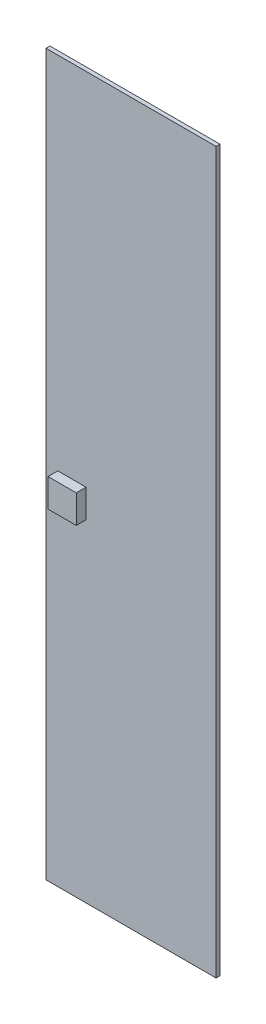
ISO-10303-21;
HEADER;
FILE_DESCRIPTION(('STEP AP214'),'2;1');
FILE_NAME('part.step','',(''),(''),'','','');
FILE_SCHEMA(('AUTOMOTIVE_DESIGN { 1 0 10303 214 1 1 1 1 }'));
ENDSEC;
DATA;
#1=APPLICATION_CONTEXT('core data for automotive mechanical design processes');
#2=APPLICATION_PROTOCOL_DEFINITION('international standard','automotive_design',2000,#1);
#3=PRODUCT_CONTEXT('',#1,'mechanical');
#4=PRODUCT('Part','Part','',(#3));
#5=PRODUCT_RELATED_PRODUCT_CATEGORY('part','',(#4));
#6=PRODUCT_DEFINITION_FORMATION('','',#4);
#7=PRODUCT_DEFINITION_CONTEXT('part definition',#1,'design');
#8=PRODUCT_DEFINITION('design','',#6,#7);
#9=PRODUCT_DEFINITION_SHAPE('','',#8);
#10=(LENGTH_UNIT() NAMED_UNIT(*) SI_UNIT(.MILLI.,.METRE.));
#11=(NAMED_UNIT(*) PLANE_ANGLE_UNIT() SI_UNIT($,.RADIAN.));
#12=(NAMED_UNIT(*) SI_UNIT($,.STERADIAN.) SOLID_ANGLE_UNIT());
#13=UNCERTAINTY_MEASURE_WITH_UNIT(LENGTH_MEASURE(1.E-05),#10,'distance_accuracy_value','');
#14=(GEOMETRIC_REPRESENTATION_CONTEXT(3) GLOBAL_UNCERTAINTY_ASSIGNED_CONTEXT((#13)) GLOBAL_UNIT_ASSIGNED_CONTEXT((#10,
#11,#12)) REPRESENTATION_CONTEXT('',''));
#15=CARTESIAN_POINT('',(0.,0.,0.));
#16=DIRECTION('',(0.,0.,1.));
#17=DIRECTION('',(1.,0.,0.));
#18=AXIS2_PLACEMENT_3D('',#15,#16,#17);
#19=CARTESIAN_POINT('',(216.75,-918.5,10.));
#20=DIRECTION('',(-1.,0.,0.));
#21=DIRECTION('',(0.,0.,1.));
#22=AXIS2_PLACEMENT_3D('',#19,#20,#21);
#23=PLANE('',#22);
#24=DIRECTION('',(0.,1.,0.));
#25=VECTOR('',#24,1.);
#26=CARTESIAN_POINT('',(216.75,-918.5,0.));
#27=LINE('',#26,#25);
#28=CARTESIAN_POINT('',(216.75,-918.5,0.));
#29=VERTEX_POINT('',#28);
#30=CARTESIAN_POINT('',(216.75,918.5,0.));
#31=VERTEX_POINT('',#30);
#32=EDGE_CURVE('E188',#29,#31,#27,.T.);
#33=ORIENTED_EDGE('',*,*,#32,.T.);
#34=DIRECTION('',(0.,0.,-1.));
#35=VECTOR('',#34,1.);
#36=CARTESIAN_POINT('',(216.75,918.5,10.));
#37=LINE('',#36,#35);
#38=CARTESIAN_POINT('',(216.75,918.5,10.));
#39=VERTEX_POINT('',#38);
#40=EDGE_CURVE('E215',#39,#31,#37,.T.);
#41=ORIENTED_EDGE('',*,*,#40,.F.);
#42=DIRECTION('',(0.,1.,0.));
#43=VECTOR('',#42,1.);
#44=CARTESIAN_POINT('',(216.75,-918.5,10.));
#45=LINE('',#44,#43);
#46=CARTESIAN_POINT('',(216.75,-918.5,10.));
#47=VERTEX_POINT('',#46);
#48=EDGE_CURVE('E189',#47,#39,#45,.T.);
#49=ORIENTED_EDGE('',*,*,#48,.F.);
#50=DIRECTION('',(0.,0.,-1.));
#51=VECTOR('',#50,1.);
#52=CARTESIAN_POINT('',(216.75,-918.5,10.));
#53=LINE('',#52,#51);
#54=EDGE_CURVE('E199',#47,#29,#53,.T.);
#55=ORIENTED_EDGE('',*,*,#54,.T.);
#56=EDGE_LOOP('',(#33,#41,#49,#55));
#57=FACE_BOUND('',#56,.T.);
#58=ADVANCED_FACE('F43',(#57),#23,.F.);
#59=CARTESIAN_POINT('',(-216.75,918.5,10.));
#60=DIRECTION('',(0.,-1.,0.));
#61=DIRECTION('',(0.,0.,-1.));
#62=AXIS2_PLACEMENT_3D('',#59,#60,#61);
#63=PLANE('',#62);
#64=DIRECTION('',(-1.,0.,0.));
#65=VECTOR('',#64,1.);
#66=CARTESIAN_POINT('',(-216.75,918.5,0.));
#67=LINE('',#66,#65);
#68=CARTESIAN_POINT('',(-216.75,918.5,0.));
#69=VERTEX_POINT('',#68);
#70=EDGE_CURVE('E202',#31,#69,#67,.T.);
#71=ORIENTED_EDGE('',*,*,#70,.T.);
#72=DIRECTION('',(0.,0.,-1.));
#73=VECTOR('',#72,1.);
#74=CARTESIAN_POINT('',(-216.75,918.5,10.));
#75=LINE('',#74,#73);
#76=CARTESIAN_POINT('',(-216.75,918.5,10.));
#77=VERTEX_POINT('',#76);
#78=EDGE_CURVE('E212',#77,#69,#75,.T.);
#79=ORIENTED_EDGE('',*,*,#78,.F.);
#80=DIRECTION('',(-1.,0.,0.));
#81=VECTOR('',#80,1.);
#82=CARTESIAN_POINT('',(-216.75,918.5,10.));
#83=LINE('',#82,#81);
#84=EDGE_CURVE('E192',#39,#77,#83,.T.);
#85=ORIENTED_EDGE('',*,*,#84,.F.);
#86=ORIENTED_EDGE('',*,*,#40,.T.);
#87=EDGE_LOOP('',(#71,#79,#85,#86));
#88=FACE_BOUND('',#87,.T.);
#89=ADVANCED_FACE('F251',(#88),#63,.F.);
#90=CARTESIAN_POINT('',(-216.75,-918.5,10.));
#91=DIRECTION('',(1.,0.,0.));
#92=DIRECTION('',(0.,0.,-1.));
#93=AXIS2_PLACEMENT_3D('',#90,#91,#92);
#94=PLANE('',#93);
#95=DIRECTION('',(0.,-1.,0.));
#96=VECTOR('',#95,1.);
#97=CARTESIAN_POINT('',(-216.75,-918.5,0.));
#98=LINE('',#97,#96);
#99=CARTESIAN_POINT('',(-216.75,-918.5,0.));
#100=VERTEX_POINT('',#99);
#101=EDGE_CURVE('E204',#69,#100,#98,.T.);
#102=ORIENTED_EDGE('',*,*,#101,.T.);
#103=DIRECTION('',(0.,0.,-1.));
#104=VECTOR('',#103,1.);
#105=CARTESIAN_POINT('',(-216.75,-918.5,10.));
#106=LINE('',#105,#104);
#107=CARTESIAN_POINT('',(-216.75,-918.5,10.));
#108=VERTEX_POINT('',#107);
#109=EDGE_CURVE('E209',#108,#100,#106,.T.);
#110=ORIENTED_EDGE('',*,*,#109,.F.);
#111=DIRECTION('',(0.,-1.,0.));
#112=VECTOR('',#111,1.);
#113=CARTESIAN_POINT('',(-216.75,-918.5,10.));
#114=LINE('',#113,#112);
#115=EDGE_CURVE('E195',#77,#108,#114,.T.);
#116=ORIENTED_EDGE('',*,*,#115,.F.);
#117=ORIENTED_EDGE('',*,*,#78,.T.);
#118=EDGE_LOOP('',(#102,#110,#116,#117));
#119=FACE_BOUND('',#118,.T.);
#120=ADVANCED_FACE('F256',(#119),#94,.F.);
#121=CARTESIAN_POINT('',(-216.75,-918.5,10.));
#122=DIRECTION('',(0.,1.,0.));
#123=DIRECTION('',(0.,0.,1.));
#124=AXIS2_PLACEMENT_3D('',#121,#122,#123);
#125=PLANE('',#124);
#126=DIRECTION('',(1.,0.,0.));
#127=VECTOR('',#126,1.);
#128=CARTESIAN_POINT('',(-216.75,-918.5,0.));
#129=LINE('',#128,#127);
#130=EDGE_CURVE('E193',#100,#29,#129,.T.);
#131=ORIENTED_EDGE('',*,*,#130,.T.);
#132=ORIENTED_EDGE('',*,*,#54,.F.);
#133=DIRECTION('',(1.,0.,0.));
#134=VECTOR('',#133,1.);
#135=CARTESIAN_POINT('',(-216.75,-918.5,10.));
#136=LINE('',#135,#134);
#137=EDGE_CURVE('E197',#108,#47,#136,.T.);
#138=ORIENTED_EDGE('',*,*,#137,.F.);
#139=ORIENTED_EDGE('',*,*,#109,.T.);
#140=EDGE_LOOP('',(#131,#132,#138,#139));
#141=FACE_BOUND('',#140,.T.);
#142=ADVANCED_FACE('F271',(#141),#125,.F.);
#143=CARTESIAN_POINT('',(0.,0.,10.));
#144=DIRECTION('',(0.,0.,-1.));
#145=DIRECTION('',(-1.,0.,0.));
#146=AXIS2_PLACEMENT_3D('',#143,#144,#145);
#147=PLANE('',#146);
#148=DIRECTION('',(1.,0.,0.));
#149=VECTOR('',#148,1.);
#150=CARTESIAN_POINT('',(0.,-2.91433543964104E-13,10.));
#151=LINE('',#150,#149);
#152=CARTESIAN_POINT('',(-186.75,-2.91433543964104E-13,10.));
#153=VERTEX_POINT('',#152);
#154=CARTESIAN_POINT('',(-114.75,-2.91433543964104E-13,10.));
#155=VERTEX_POINT('',#154);
#156=EDGE_CURVE('E170',#153,#155,#151,.T.);
#157=ORIENTED_EDGE('',*,*,#156,.T.);
#158=DIRECTION('',(0.,-1.,0.));
#159=VECTOR('',#158,1.);
#160=CARTESIAN_POINT('',(-114.75,0.,10.));
#161=LINE('',#160,#159);
#162=CARTESIAN_POINT('',(-114.75,-72.0000000000003,10.));
#163=VERTEX_POINT('',#162);
#164=EDGE_CURVE('E133',#155,#163,#161,.T.);
#165=ORIENTED_EDGE('',*,*,#164,.T.);
#166=DIRECTION('',(-1.,0.,0.));
#167=VECTOR('',#166,1.);
#168=CARTESIAN_POINT('',(0.,-72.0000000000003,10.));
#169=LINE('',#168,#167);
#170=CARTESIAN_POINT('',(-186.75,-72.0000000000003,10.));
#171=VERTEX_POINT('',#170);
#172=EDGE_CURVE('E184',#163,#171,#169,.T.);
#173=ORIENTED_EDGE('',*,*,#172,.T.);
#174=DIRECTION('',(0.,1.,0.));
#175=VECTOR('',#174,1.);
#176=CARTESIAN_POINT('',(-186.75,0.,10.));
#177=LINE('',#176,#175);
#178=EDGE_CURVE('E181',#171,#153,#177,.T.);
#179=ORIENTED_EDGE('',*,*,#178,.T.);
#180=EDGE_LOOP('',(#157,#165,#173,#179));
#181=FACE_BOUND('',#180,.T.);
#182=ORIENTED_EDGE('',*,*,#48,.T.);
#183=ORIENTED_EDGE('',*,*,#84,.T.);
#184=ORIENTED_EDGE('',*,*,#115,.T.);
#185=ORIENTED_EDGE('',*,*,#137,.T.);
#186=EDGE_LOOP('',(#182,#183,#184,#185));
#187=FACE_BOUND('',#186,.T.);
#188=ADVANCED_FACE('F267',(#181,#187),#147,.F.);
#189=CARTESIAN_POINT('',(0.,0.,0.));
#190=DIRECTION('',(0.,0.,-1.));
#191=DIRECTION('',(-1.,0.,0.));
#192=AXIS2_PLACEMENT_3D('',#189,#190,#191);
#193=PLANE('',#192);
#194=DIRECTION('',(0.,-1.,0.));
#195=VECTOR('',#194,1.);
#196=CARTESIAN_POINT('',(-114.75,0.,0.));
#197=LINE('',#196,#195);
#198=CARTESIAN_POINT('',(-114.75,-2.91433543964104E-13,0.));
#199=VERTEX_POINT('',#198);
#200=CARTESIAN_POINT('',(-114.75,-72.0000000000003,0.));
#201=VERTEX_POINT('',#200);
#202=EDGE_CURVE('E11',#199,#201,#197,.T.);
#203=ORIENTED_EDGE('',*,*,#202,.F.);
#204=DIRECTION('',(1.,0.,0.));
#205=VECTOR('',#204,1.);
#206=CARTESIAN_POINT('',(0.,-2.91433543964104E-13,0.));
#207=LINE('',#206,#205);
#208=CARTESIAN_POINT('',(-186.75,-2.91433543964104E-13,0.));
#209=VERTEX_POINT('',#208);
#210=EDGE_CURVE('E218',#209,#199,#207,.T.);
#211=ORIENTED_EDGE('',*,*,#210,.F.);
#212=DIRECTION('',(0.,1.,0.));
#213=VECTOR('',#212,1.);
#214=CARTESIAN_POINT('',(-186.75,0.,0.));
#215=LINE('',#214,#213);
#216=CARTESIAN_POINT('',(-186.75,-72.0000000000003,0.));
#217=VERTEX_POINT('',#216);
#218=EDGE_CURVE('E221',#217,#209,#215,.T.);
#219=ORIENTED_EDGE('',*,*,#218,.F.);
#220=DIRECTION('',(-1.,0.,0.));
#221=VECTOR('',#220,1.);
#222=CARTESIAN_POINT('',(0.,-72.0000000000003,0.));
#223=LINE('',#222,#221);
#224=EDGE_CURVE('E50',#201,#217,#223,.T.);
#225=ORIENTED_EDGE('',*,*,#224,.F.);
#226=EDGE_LOOP('',(#203,#211,#219,#225));
#227=FACE_BOUND('',#226,.T.);
#228=ORIENTED_EDGE('',*,*,#32,.F.);
#229=ORIENTED_EDGE('',*,*,#130,.F.);
#230=ORIENTED_EDGE('',*,*,#101,.F.);
#231=ORIENTED_EDGE('',*,*,#70,.F.);
#232=EDGE_LOOP('',(#228,#229,#230,#231));
#233=FACE_BOUND('',#232,.T.);
#234=ADVANCED_FACE('F235',(#227,#233),#193,.T.);
#235=CARTESIAN_POINT('',(0.,0.,-30.));
#236=DIRECTION('',(0.,0.,-1.));
#237=DIRECTION('',(-1.,0.,0.));
#238=AXIS2_PLACEMENT_3D('',#235,#236,#237);
#239=PLANE('',#238);
#240=DIRECTION('',(0.,1.,0.));
#241=VECTOR('',#240,1.);
#242=CARTESIAN_POINT('',(-114.75,-72.0000000000003,-30.));
#243=LINE('',#242,#241);
#244=CARTESIAN_POINT('',(-114.75,-72.0000000000003,-30.));
#245=VERTEX_POINT('',#244);
#246=CARTESIAN_POINT('',(-114.75,-2.91433543964104E-13,-30.));
#247=VERTEX_POINT('',#246);
#248=EDGE_CURVE('E156',#245,#247,#243,.T.);
#249=ORIENTED_EDGE('',*,*,#248,.F.);
#250=DIRECTION('',(1.,0.,0.));
#251=VECTOR('',#250,1.);
#252=CARTESIAN_POINT('',(-186.75,-72.0000000000003,-30.));
#253=LINE('',#252,#251);
#254=CARTESIAN_POINT('',(-186.75,-72.0000000000003,-30.));
#255=VERTEX_POINT('',#254);
#256=EDGE_CURVE('E136',#255,#245,#253,.T.);
#257=ORIENTED_EDGE('',*,*,#256,.F.);
#258=DIRECTION('',(0.,-1.,0.));
#259=VECTOR('',#258,1.);
#260=CARTESIAN_POINT('',(-186.75,-72.0000000000003,-30.));
#261=LINE('',#260,#259);
#262=CARTESIAN_POINT('',(-186.75,-2.91433543964104E-13,-30.));
#263=VERTEX_POINT('',#262);
#264=EDGE_CURVE('E162',#263,#255,#261,.T.);
#265=ORIENTED_EDGE('',*,*,#264,.F.);
#266=DIRECTION('',(-1.,0.,0.));
#267=VECTOR('',#266,1.);
#268=CARTESIAN_POINT('',(-186.75,-2.91433543964104E-13,-30.));
#269=LINE('',#268,#267);
#270=EDGE_CURVE('E159',#247,#263,#269,.T.);
#271=ORIENTED_EDGE('',*,*,#270,.F.);
#272=EDGE_LOOP('',(#249,#257,#265,#271));
#273=FACE_BOUND('',#272,.T.);
#274=ADVANCED_FACE('F232',(#273),#239,.T.);
#275=CARTESIAN_POINT('',(-186.75,-2.91433543964104E-13,-30.));
#276=DIRECTION('',(0.,1.,0.));
#277=DIRECTION('',(0.,0.,1.));
#278=AXIS2_PLACEMENT_3D('',#275,#276,#277);
#279=PLANE('',#278);
#280=DIRECTION('',(0.,0.,1.));
#281=VECTOR('',#280,1.);
#282=CARTESIAN_POINT('',(-186.75,-2.91433543964104E-13,-30.));
#283=LINE('',#282,#281);
#284=EDGE_CURVE('E176',#263,#209,#283,.T.);
#285=ORIENTED_EDGE('',*,*,#284,.T.);
#286=ORIENTED_EDGE('',*,*,#210,.T.);
#287=DIRECTION('',(0.,0.,1.));
#288=VECTOR('',#287,1.);
#289=CARTESIAN_POINT('',(-114.75,-2.91433543964104E-13,-30.));
#290=LINE('',#289,#288);
#291=EDGE_CURVE('E135',#247,#199,#290,.T.);
#292=ORIENTED_EDGE('',*,*,#291,.F.);
#293=ORIENTED_EDGE('',*,*,#270,.T.);
#294=EDGE_LOOP('',(#285,#286,#292,#293));
#295=FACE_BOUND('',#294,.T.);
#296=ADVANCED_FACE('F238',(#295),#279,.T.);
#297=CARTESIAN_POINT('',(-186.75,-72.0000000000003,-30.));
#298=DIRECTION('',(-1.,0.,0.));
#299=DIRECTION('',(0.,0.,1.));
#300=AXIS2_PLACEMENT_3D('',#297,#298,#299);
#301=PLANE('',#300);
#302=DIRECTION('',(0.,0.,1.));
#303=VECTOR('',#302,1.);
#304=CARTESIAN_POINT('',(-186.75,-72.0000000000003,-30.));
#305=LINE('',#304,#303);
#306=EDGE_CURVE('E172',#255,#217,#305,.T.);
#307=ORIENTED_EDGE('',*,*,#306,.T.);
#308=ORIENTED_EDGE('',*,*,#218,.T.);
#309=ORIENTED_EDGE('',*,*,#284,.F.);
#310=ORIENTED_EDGE('',*,*,#264,.T.);
#311=EDGE_LOOP('',(#307,#308,#309,#310));
#312=FACE_BOUND('',#311,.T.);
#313=ADVANCED_FACE('F226',(#312),#301,.T.);
#314=CARTESIAN_POINT('',(-186.75,-72.0000000000003,-30.));
#315=DIRECTION('',(0.,-1.,0.));
#316=DIRECTION('',(0.,0.,-1.));
#317=AXIS2_PLACEMENT_3D('',#314,#315,#316);
#318=PLANE('',#317);
#319=DIRECTION('',(0.,0.,1.));
#320=VECTOR('',#319,1.);
#321=CARTESIAN_POINT('',(-114.75,-72.0000000000003,-30.));
#322=LINE('',#321,#320);
#323=EDGE_CURVE('E167',#245,#201,#322,.T.);
#324=ORIENTED_EDGE('',*,*,#323,.T.);
#325=ORIENTED_EDGE('',*,*,#224,.T.);
#326=ORIENTED_EDGE('',*,*,#306,.F.);
#327=ORIENTED_EDGE('',*,*,#256,.T.);
#328=EDGE_LOOP('',(#324,#325,#326,#327));
#329=FACE_BOUND('',#328,.T.);
#330=ADVANCED_FACE('F224',(#329),#318,.T.);
#331=CARTESIAN_POINT('',(-114.75,-72.0000000000003,-30.));
#332=DIRECTION('',(1.,0.,0.));
#333=DIRECTION('',(0.,0.,-1.));
#334=AXIS2_PLACEMENT_3D('',#331,#332,#333);
#335=PLANE('',#334);
#336=ORIENTED_EDGE('',*,*,#291,.T.);
#337=ORIENTED_EDGE('',*,*,#202,.T.);
#338=ORIENTED_EDGE('',*,*,#323,.F.);
#339=ORIENTED_EDGE('',*,*,#248,.T.);
#340=EDGE_LOOP('',(#336,#337,#338,#339));
#341=FACE_BOUND('',#340,.T.);
#342=ADVANCED_FACE('F234',(#341),#335,.T.);
#343=ORIENTED_EDGE('',*,*,#164,.F.);
#344=CARTESIAN_POINT('',(-114.75,-2.91433543964104E-13,35.));
#345=VERTEX_POINT('',#344);
#346=EDGE_CURVE('E57',#155,#345,#290,.T.);
#347=ORIENTED_EDGE('',*,*,#346,.T.);
#348=DIRECTION('',(0.,1.,0.));
#349=VECTOR('',#348,1.);
#350=CARTESIAN_POINT('',(-114.75,-72.0000000000003,35.));
#351=LINE('',#350,#349);
#352=CARTESIAN_POINT('',(-114.75,-72.0000000000003,35.));
#353=VERTEX_POINT('',#352);
#354=EDGE_CURVE('E131',#353,#345,#351,.T.);
#355=ORIENTED_EDGE('',*,*,#354,.F.);
#356=EDGE_CURVE('E171',#163,#353,#322,.T.);
#357=ORIENTED_EDGE('',*,*,#356,.F.);
#358=EDGE_LOOP('',(#343,#347,#355,#357));
#359=FACE_BOUND('',#358,.T.);
#360=ADVANCED_FACE('F128',(#359),#335,.T.);
#361=ORIENTED_EDGE('',*,*,#172,.F.);
#362=ORIENTED_EDGE('',*,*,#356,.T.);
#363=DIRECTION('',(1.,0.,0.));
#364=VECTOR('',#363,1.);
#365=CARTESIAN_POINT('',(-186.75,-72.0000000000003,35.));
#366=LINE('',#365,#364);
#367=CARTESIAN_POINT('',(-186.75,-72.0000000000003,35.));
#368=VERTEX_POINT('',#367);
#369=EDGE_CURVE('E151',#368,#353,#366,.T.);
#370=ORIENTED_EDGE('',*,*,#369,.F.);
#371=EDGE_CURVE('E175',#171,#368,#305,.T.);
#372=ORIENTED_EDGE('',*,*,#371,.F.);
#373=EDGE_LOOP('',(#361,#362,#370,#372));
#374=FACE_BOUND('',#373,.T.);
#375=ADVANCED_FACE('F289',(#374),#318,.T.);
#376=ORIENTED_EDGE('',*,*,#178,.F.);
#377=ORIENTED_EDGE('',*,*,#371,.T.);
#378=DIRECTION('',(0.,-1.,0.));
#379=VECTOR('',#378,1.);
#380=CARTESIAN_POINT('',(-186.75,-72.0000000000003,35.));
#381=LINE('',#380,#379);
#382=CARTESIAN_POINT('',(-186.75,-2.91433543964104E-13,35.));
#383=VERTEX_POINT('',#382);
#384=EDGE_CURVE('E146',#383,#368,#381,.T.);
#385=ORIENTED_EDGE('',*,*,#384,.F.);
#386=EDGE_CURVE('E142',#153,#383,#283,.T.);
#387=ORIENTED_EDGE('',*,*,#386,.F.);
#388=EDGE_LOOP('',(#376,#377,#385,#387));
#389=FACE_BOUND('',#388,.T.);
#390=ADVANCED_FACE('F246',(#389),#301,.T.);
#391=ORIENTED_EDGE('',*,*,#156,.F.);
#392=ORIENTED_EDGE('',*,*,#386,.T.);
#393=DIRECTION('',(-1.,0.,0.));
#394=VECTOR('',#393,1.);
#395=CARTESIAN_POINT('',(-186.75,-2.91433543964104E-13,35.));
#396=LINE('',#395,#394);
#397=EDGE_CURVE('E139',#345,#383,#396,.T.);
#398=ORIENTED_EDGE('',*,*,#397,.F.);
#399=ORIENTED_EDGE('',*,*,#346,.F.);
#400=EDGE_LOOP('',(#391,#392,#398,#399));
#401=FACE_BOUND('',#400,.T.);
#402=ADVANCED_FACE('F140',(#401),#279,.T.);
#403=CARTESIAN_POINT('',(0.,0.,35.));
#404=DIRECTION('',(0.,0.,-1.));
#405=DIRECTION('',(-1.,0.,0.));
#406=AXIS2_PLACEMENT_3D('',#403,#404,#405);
#407=PLANE('',#406);
#408=ORIENTED_EDGE('',*,*,#354,.T.);
#409=ORIENTED_EDGE('',*,*,#397,.T.);
#410=ORIENTED_EDGE('',*,*,#384,.T.);
#411=ORIENTED_EDGE('',*,*,#369,.T.);
#412=EDGE_LOOP('',(#408,#409,#410,#411));
#413=FACE_BOUND('',#412,.T.);
#414=ADVANCED_FACE('F149',(#413),#407,.F.);
#415=CLOSED_SHELL('',(#58,#89,#120,#142,#188,#234,#274,#296,#313,#330,#342,#360,#375,#390,#402,#414));
#416=MANIFOLD_SOLID_BREP('B2',#415);
#417=ADVANCED_BREP_SHAPE_REPRESENTATION('',(#18,#416),#14);
#418=SHAPE_DEFINITION_REPRESENTATION(#9,#417);
ENDSEC;
END-ISO-10303-21;
